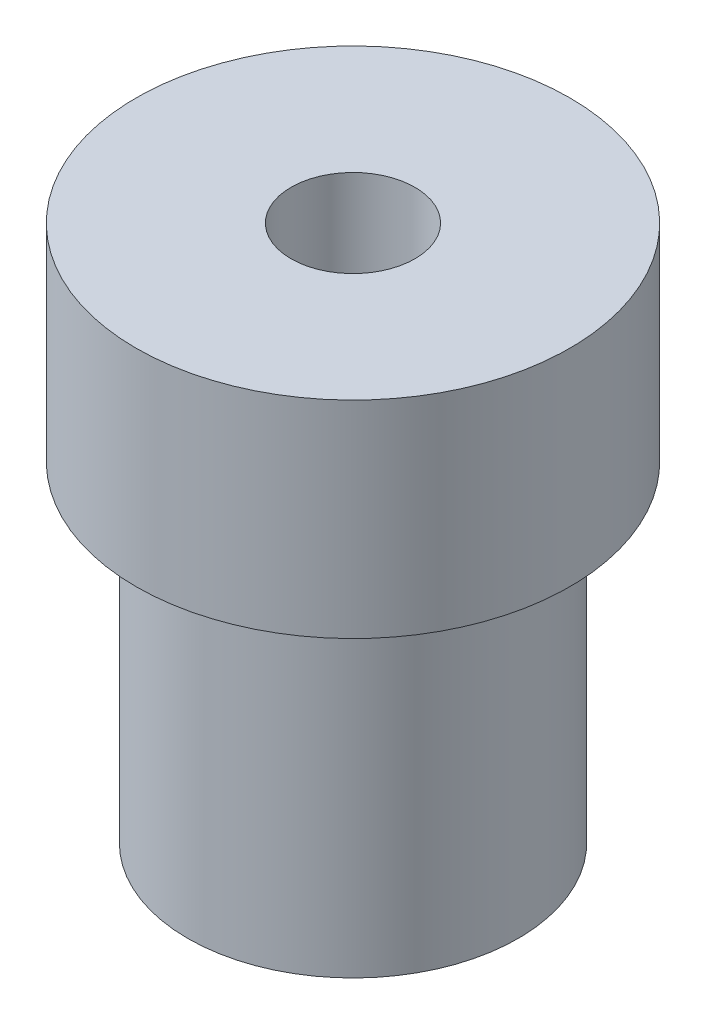
ISO-10303-21;
HEADER;
FILE_DESCRIPTION(('STEP AP214'),'2;1');
FILE_NAME('part.step','',(''),(''),'','','');
FILE_SCHEMA(('AUTOMOTIVE_DESIGN { 1 0 10303 214 1 1 1 1 }'));
ENDSEC;
DATA;
#1=APPLICATION_CONTEXT('core data for automotive mechanical design processes');
#2=APPLICATION_PROTOCOL_DEFINITION('international standard','automotive_design',2000,#1);
#3=PRODUCT_CONTEXT('',#1,'mechanical');
#4=PRODUCT('Part','Part','',(#3));
#5=PRODUCT_RELATED_PRODUCT_CATEGORY('part','',(#4));
#6=PRODUCT_DEFINITION_FORMATION('','',#4);
#7=PRODUCT_DEFINITION_CONTEXT('part definition',#1,'design');
#8=PRODUCT_DEFINITION('design','',#6,#7);
#9=PRODUCT_DEFINITION_SHAPE('','',#8);
#10=(LENGTH_UNIT() NAMED_UNIT(*) SI_UNIT(.MILLI.,.METRE.));
#11=(NAMED_UNIT(*) PLANE_ANGLE_UNIT() SI_UNIT($,.RADIAN.));
#12=(NAMED_UNIT(*) SI_UNIT($,.STERADIAN.) SOLID_ANGLE_UNIT());
#13=UNCERTAINTY_MEASURE_WITH_UNIT(LENGTH_MEASURE(1.E-05),#10,'distance_accuracy_value','');
#14=(GEOMETRIC_REPRESENTATION_CONTEXT(3) GLOBAL_UNCERTAINTY_ASSIGNED_CONTEXT((#13)) GLOBAL_UNIT_ASSIGNED_CONTEXT((#10,
#11,#12)) REPRESENTATION_CONTEXT('',''));
#15=CARTESIAN_POINT('',(0.,0.,0.));
#16=DIRECTION('',(0.,0.,1.));
#17=DIRECTION('',(1.,0.,0.));
#18=AXIS2_PLACEMENT_3D('',#15,#16,#17);
#19=CARTESIAN_POINT('',(0.,10.,0.));
#20=DIRECTION('',(0.,-1.,0.));
#21=DIRECTION('',(0.,0.,-1.));
#22=AXIS2_PLACEMENT_3D('',#19,#20,#21);
#23=CYLINDRICAL_SURFACE('',#22,10.5);
#24=CARTESIAN_POINT('',(0.,10.,0.));
#25=DIRECTION('',(0.,1.,0.));
#26=DIRECTION('',(0.,0.,1.));
#27=AXIS2_PLACEMENT_3D('',#24,#25,#26);
#28=CIRCLE('',#27,10.5);
#29=CARTESIAN_POINT('',(0.,10.,10.5));
#30=VERTEX_POINT('',#29);
#31=EDGE_CURVE('E10',#30,#30,#28,.T.);
#32=ORIENTED_EDGE('',*,*,#31,.F.);
#33=EDGE_LOOP('',(#32));
#34=FACE_BOUND('',#33,.T.);
#35=CARTESIAN_POINT('',(0.,0.,0.));
#36=DIRECTION('',(0.,1.,0.));
#37=DIRECTION('',(0.,0.,1.));
#38=AXIS2_PLACEMENT_3D('',#35,#36,#37);
#39=CIRCLE('',#38,10.5);
#40=CARTESIAN_POINT('',(0.,0.,10.5));
#41=VERTEX_POINT('',#40);
#42=EDGE_CURVE('E34',#41,#41,#39,.T.);
#43=ORIENTED_EDGE('',*,*,#42,.T.);
#44=EDGE_LOOP('',(#43));
#45=FACE_BOUND('',#44,.T.);
#46=ADVANCED_FACE('F31',(#34,#45),#23,.T.);
#47=CARTESIAN_POINT('',(0.,10.,0.));
#48=DIRECTION('',(0.,1.,0.));
#49=DIRECTION('',(0.,0.,1.));
#50=AXIS2_PLACEMENT_3D('',#47,#48,#49);
#51=PLANE('',#50);
#52=CARTESIAN_POINT('',(0.,10.,0.));
#53=DIRECTION('',(0.,1.,0.));
#54=DIRECTION('',(0.,0.,1.));
#55=AXIS2_PLACEMENT_3D('',#52,#53,#54);
#56=CIRCLE('',#55,3.);
#57=CARTESIAN_POINT('',(0.,10.,3.));
#58=VERTEX_POINT('',#57);
#59=EDGE_CURVE('E51',#58,#58,#56,.T.);
#60=ORIENTED_EDGE('',*,*,#59,.F.);
#61=EDGE_LOOP('',(#60));
#62=FACE_BOUND('',#61,.T.);
#63=ORIENTED_EDGE('',*,*,#31,.T.);
#64=EDGE_LOOP('',(#63));
#65=FACE_BOUND('',#64,.T.);
#66=ADVANCED_FACE('F57',(#62,#65),#51,.T.);
#67=CARTESIAN_POINT('',(0.,0.,0.));
#68=DIRECTION('',(0.,1.,0.));
#69=DIRECTION('',(0.,0.,1.));
#70=AXIS2_PLACEMENT_3D('',#67,#68,#69);
#71=PLANE('',#70);
#72=CARTESIAN_POINT('',(0.,0.,0.));
#73=DIRECTION('',(0.,1.,0.));
#74=DIRECTION('',(0.,0.,1.));
#75=AXIS2_PLACEMENT_3D('',#72,#73,#74);
#76=CIRCLE('',#75,8.);
#77=CARTESIAN_POINT('',(0.,0.,8.));
#78=VERTEX_POINT('',#77);
#79=EDGE_CURVE('E43',#78,#78,#76,.T.);
#80=ORIENTED_EDGE('',*,*,#79,.T.);
#81=EDGE_LOOP('',(#80));
#82=FACE_BOUND('',#81,.T.);
#83=ORIENTED_EDGE('',*,*,#42,.F.);
#84=EDGE_LOOP('',(#83));
#85=FACE_BOUND('',#84,.T.);
#86=ADVANCED_FACE('F59',(#82,#85),#71,.F.);
#87=CARTESIAN_POINT('',(0.,-16.,0.));
#88=DIRECTION('',(0.,1.,0.));
#89=DIRECTION('',(0.,0.,1.));
#90=AXIS2_PLACEMENT_3D('',#87,#88,#89);
#91=CYLINDRICAL_SURFACE('',#90,8.);
#92=CARTESIAN_POINT('',(0.,-16.,0.));
#93=DIRECTION('',(0.,1.,0.));
#94=DIRECTION('',(0.,0.,1.));
#95=AXIS2_PLACEMENT_3D('',#92,#93,#94);
#96=CIRCLE('',#95,8.);
#97=CARTESIAN_POINT('',(0.,-16.,8.));
#98=VERTEX_POINT('',#97);
#99=EDGE_CURVE('E41',#98,#98,#96,.T.);
#100=ORIENTED_EDGE('',*,*,#99,.T.);
#101=EDGE_LOOP('',(#100));
#102=FACE_BOUND('',#101,.T.);
#103=ORIENTED_EDGE('',*,*,#79,.F.);
#104=EDGE_LOOP('',(#103));
#105=FACE_BOUND('',#104,.T.);
#106=ADVANCED_FACE('F65',(#102,#105),#91,.T.);
#107=CARTESIAN_POINT('',(0.,-16.,0.));
#108=DIRECTION('',(0.,1.,0.));
#109=DIRECTION('',(0.,0.,1.));
#110=AXIS2_PLACEMENT_3D('',#107,#108,#109);
#111=PLANE('',#110);
#112=CARTESIAN_POINT('',(0.,-16.,0.));
#113=DIRECTION('',(0.,1.,0.));
#114=DIRECTION('',(0.,0.,1.));
#115=AXIS2_PLACEMENT_3D('',#112,#113,#114);
#116=CIRCLE('',#115,3.);
#117=CARTESIAN_POINT('',(0.,-16.,3.));
#118=VERTEX_POINT('',#117);
#119=EDGE_CURVE('E46',#118,#118,#116,.T.);
#120=ORIENTED_EDGE('',*,*,#119,.T.);
#121=EDGE_LOOP('',(#120));
#122=FACE_BOUND('',#121,.T.);
#123=ORIENTED_EDGE('',*,*,#99,.F.);
#124=EDGE_LOOP('',(#123));
#125=FACE_BOUND('',#124,.T.);
#126=ADVANCED_FACE('F71',(#122,#125),#111,.F.);
#127=CARTESIAN_POINT('',(0.,-16.,0.));
#128=DIRECTION('',(0.,1.,0.));
#129=DIRECTION('',(0.,0.,1.));
#130=AXIS2_PLACEMENT_3D('',#127,#128,#129);
#131=CYLINDRICAL_SURFACE('',#130,3.);
#132=ORIENTED_EDGE('',*,*,#119,.F.);
#133=EDGE_LOOP('',(#132));
#134=FACE_BOUND('',#133,.T.);
#135=ORIENTED_EDGE('',*,*,#59,.T.);
#136=EDGE_LOOP('',(#135));
#137=FACE_BOUND('',#136,.T.);
#138=ADVANCED_FACE('F55',(#134,#137),#131,.F.);
#139=CLOSED_SHELL('',(#46,#66,#86,#106,#126,#138));
#140=MANIFOLD_SOLID_BREP('B2',#139);
#141=ADVANCED_BREP_SHAPE_REPRESENTATION('',(#18,#140),#14);
#142=SHAPE_DEFINITION_REPRESENTATION(#9,#141);
ENDSEC;
END-ISO-10303-21;
